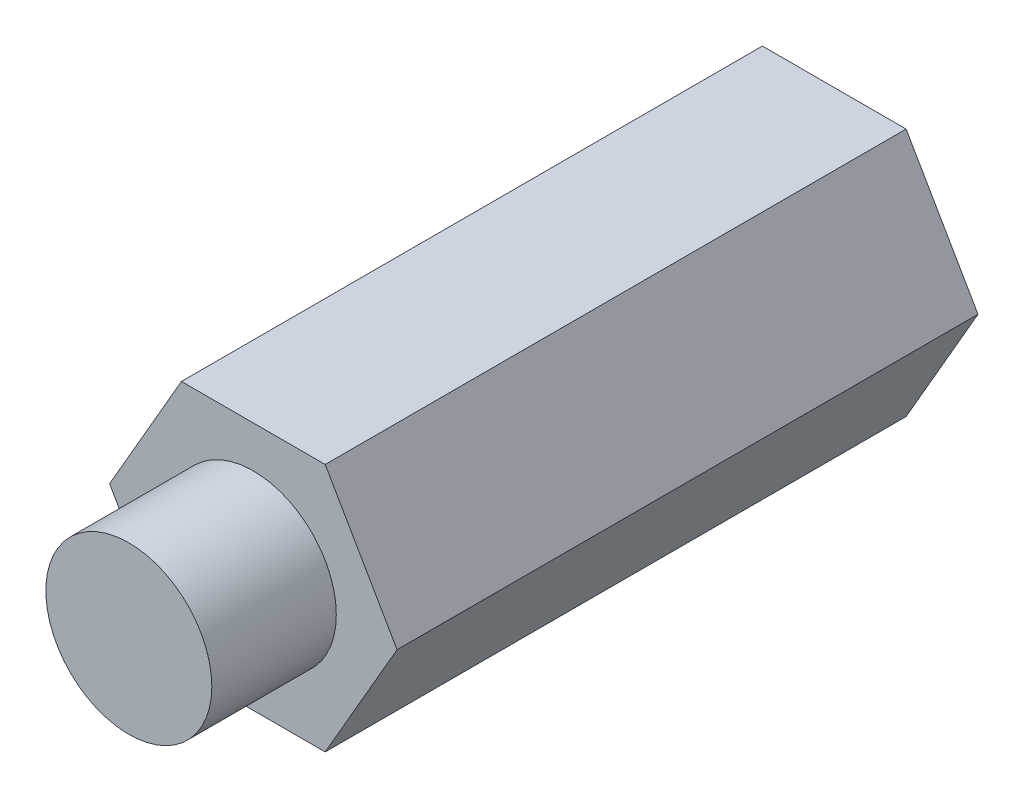
ISO-10303-21;
HEADER;
FILE_DESCRIPTION(('STEP AP214'),'2;1');
FILE_NAME('part.step','',(''),(''),'','','');
FILE_SCHEMA(('AUTOMOTIVE_DESIGN { 1 0 10303 214 1 1 1 1 }'));
ENDSEC;
DATA;
#1=APPLICATION_CONTEXT('core data for automotive mechanical design processes');
#2=APPLICATION_PROTOCOL_DEFINITION('international standard','automotive_design',2000,#1);
#3=PRODUCT_CONTEXT('',#1,'mechanical');
#4=PRODUCT('Part','Part','',(#3));
#5=PRODUCT_RELATED_PRODUCT_CATEGORY('part','',(#4));
#6=PRODUCT_DEFINITION_FORMATION('','',#4);
#7=PRODUCT_DEFINITION_CONTEXT('part definition',#1,'design');
#8=PRODUCT_DEFINITION('design','',#6,#7);
#9=PRODUCT_DEFINITION_SHAPE('','',#8);
#10=(LENGTH_UNIT() NAMED_UNIT(*) SI_UNIT(.MILLI.,.METRE.));
#11=(NAMED_UNIT(*) PLANE_ANGLE_UNIT() SI_UNIT($,.RADIAN.));
#12=(NAMED_UNIT(*) SI_UNIT($,.STERADIAN.) SOLID_ANGLE_UNIT());
#13=UNCERTAINTY_MEASURE_WITH_UNIT(LENGTH_MEASURE(1.E-05),#10,'distance_accuracy_value','');
#14=(GEOMETRIC_REPRESENTATION_CONTEXT(3) GLOBAL_UNCERTAINTY_ASSIGNED_CONTEXT((#13)) GLOBAL_UNIT_ASSIGNED_CONTEXT((#10,
#11,#12)) REPRESENTATION_CONTEXT('',''));
#15=CARTESIAN_POINT('',(0.,0.,0.));
#16=DIRECTION('',(0.,0.,1.));
#17=DIRECTION('',(1.,0.,0.));
#18=AXIS2_PLACEMENT_3D('',#15,#16,#17);
#19=CARTESIAN_POINT('',(3.46410161513775,0.,14.));
#20=DIRECTION('',(-0.866025403784438,-0.5,0.));
#21=DIRECTION('',(0.5,-0.866025403784439,0.));
#22=AXIS2_PLACEMENT_3D('',#19,#20,#21);
#23=PLANE('',#22);
#24=DIRECTION('',(-0.5,0.866025403784438,0.));
#25=VECTOR('',#24,1.);
#26=CARTESIAN_POINT('',(3.46410161513775,0.,0.));
#27=LINE('',#26,#25);
#28=CARTESIAN_POINT('',(3.46410161513775,0.,0.));
#29=VERTEX_POINT('',#28);
#30=CARTESIAN_POINT('',(1.73205080756888,3.,0.));
#31=VERTEX_POINT('',#30);
#32=EDGE_CURVE('E121',#29,#31,#27,.T.);
#33=ORIENTED_EDGE('',*,*,#32,.T.);
#34=DIRECTION('',(0.,0.,-1.));
#35=VECTOR('',#34,1.);
#36=CARTESIAN_POINT('',(1.73205080756888,3.,14.));
#37=LINE('',#36,#35);
#38=CARTESIAN_POINT('',(1.73205080756888,3.,14.));
#39=VERTEX_POINT('',#38);
#40=EDGE_CURVE('E36',#39,#31,#37,.T.);
#41=ORIENTED_EDGE('',*,*,#40,.F.);
#42=DIRECTION('',(-0.5,0.866025403784438,0.));
#43=VECTOR('',#42,1.);
#44=CARTESIAN_POINT('',(3.46410161513775,0.,14.));
#45=LINE('',#44,#43);
#46=CARTESIAN_POINT('',(3.46410161513775,0.,14.));
#47=VERTEX_POINT('',#46);
#48=EDGE_CURVE('E132',#47,#39,#45,.T.);
#49=ORIENTED_EDGE('',*,*,#48,.F.);
#50=DIRECTION('',(0.,0.,-1.));
#51=VECTOR('',#50,1.);
#52=CARTESIAN_POINT('',(3.46410161513775,0.,14.));
#53=LINE('',#52,#51);
#54=EDGE_CURVE('E117',#47,#29,#53,.T.);
#55=ORIENTED_EDGE('',*,*,#54,.T.);
#56=EDGE_LOOP('',(#33,#41,#49,#55));
#57=FACE_BOUND('',#56,.T.);
#58=ADVANCED_FACE('F33',(#57),#23,.F.);
#59=CARTESIAN_POINT('',(1.73205080756888,3.,14.));
#60=DIRECTION('',(0.,-1.,0.));
#61=DIRECTION('',(0.,0.,-1.));
#62=AXIS2_PLACEMENT_3D('',#59,#60,#61);
#63=PLANE('',#62);
#64=DIRECTION('',(-1.,0.,0.));
#65=VECTOR('',#64,1.);
#66=CARTESIAN_POINT('',(1.73205080756888,3.,0.));
#67=LINE('',#66,#65);
#68=CARTESIAN_POINT('',(-1.73205080756888,3.,0.));
#69=VERTEX_POINT('',#68);
#70=EDGE_CURVE('E124',#31,#69,#67,.T.);
#71=ORIENTED_EDGE('',*,*,#70,.T.);
#72=DIRECTION('',(0.,0.,-1.));
#73=VECTOR('',#72,1.);
#74=CARTESIAN_POINT('',(-1.73205080756888,3.,14.));
#75=LINE('',#74,#73);
#76=CARTESIAN_POINT('',(-1.73205080756888,3.,14.));
#77=VERTEX_POINT('',#76);
#78=EDGE_CURVE('E135',#77,#69,#75,.T.);
#79=ORIENTED_EDGE('',*,*,#78,.F.);
#80=DIRECTION('',(-1.,0.,0.));
#81=VECTOR('',#80,1.);
#82=CARTESIAN_POINT('',(1.73205080756888,3.,14.));
#83=LINE('',#82,#81);
#84=EDGE_CURVE('E89',#39,#77,#83,.T.);
#85=ORIENTED_EDGE('',*,*,#84,.F.);
#86=ORIENTED_EDGE('',*,*,#40,.T.);
#87=EDGE_LOOP('',(#71,#79,#85,#86));
#88=FACE_BOUND('',#87,.T.);
#89=ADVANCED_FACE('F140',(#88),#63,.F.);
#90=CARTESIAN_POINT('',(-1.73205080756888,3.,14.));
#91=DIRECTION('',(0.866025403784439,-0.499999999999999,0.));
#92=DIRECTION('',(0.499999999999999,0.866025403784439,0.));
#93=AXIS2_PLACEMENT_3D('',#90,#91,#92);
#94=PLANE('',#93);
#95=DIRECTION('',(-0.499999999999999,-0.866025403784439,0.));
#96=VECTOR('',#95,1.);
#97=CARTESIAN_POINT('',(-1.73205080756888,3.,0.));
#98=LINE('',#97,#96);
#99=CARTESIAN_POINT('',(-3.46410161513775,0.,0.));
#100=VERTEX_POINT('',#99);
#101=EDGE_CURVE('E127',#69,#100,#98,.T.);
#102=ORIENTED_EDGE('',*,*,#101,.T.);
#103=DIRECTION('',(0.,0.,-1.));
#104=VECTOR('',#103,1.);
#105=CARTESIAN_POINT('',(-3.46410161513775,0.,14.));
#106=LINE('',#105,#104);
#107=CARTESIAN_POINT('',(-3.46410161513775,0.,14.));
#108=VERTEX_POINT('',#107);
#109=EDGE_CURVE('E112',#108,#100,#106,.T.);
#110=ORIENTED_EDGE('',*,*,#109,.F.);
#111=DIRECTION('',(-0.499999999999999,-0.866025403784439,0.));
#112=VECTOR('',#111,1.);
#113=CARTESIAN_POINT('',(-1.73205080756888,3.,14.));
#114=LINE('',#113,#112);
#115=EDGE_CURVE('E103',#77,#108,#114,.T.);
#116=ORIENTED_EDGE('',*,*,#115,.F.);
#117=ORIENTED_EDGE('',*,*,#78,.T.);
#118=EDGE_LOOP('',(#102,#110,#116,#117));
#119=FACE_BOUND('',#118,.T.);
#120=ADVANCED_FACE('F146',(#119),#94,.F.);
#121=CARTESIAN_POINT('',(-3.46410161513775,0.,14.));
#122=DIRECTION('',(0.866025403784438,0.5,0.));
#123=DIRECTION('',(-0.5,0.866025403784438,0.));
#124=AXIS2_PLACEMENT_3D('',#121,#122,#123);
#125=PLANE('',#124);
#126=DIRECTION('',(0.5,-0.866025403784438,0.));
#127=VECTOR('',#126,1.);
#128=CARTESIAN_POINT('',(-3.46410161513775,0.,0.));
#129=LINE('',#128,#127);
#130=CARTESIAN_POINT('',(-1.73205080756887,-3.,0.));
#131=VERTEX_POINT('',#130);
#132=EDGE_CURVE('E111',#100,#131,#129,.T.);
#133=ORIENTED_EDGE('',*,*,#132,.T.);
#134=DIRECTION('',(0.,0.,-1.));
#135=VECTOR('',#134,1.);
#136=CARTESIAN_POINT('',(-1.73205080756887,-3.,14.));
#137=LINE('',#136,#135);
#138=CARTESIAN_POINT('',(-1.73205080756887,-3.,14.));
#139=VERTEX_POINT('',#138);
#140=EDGE_CURVE('E108',#139,#131,#137,.T.);
#141=ORIENTED_EDGE('',*,*,#140,.F.);
#142=DIRECTION('',(0.5,-0.866025403784438,0.));
#143=VECTOR('',#142,1.);
#144=CARTESIAN_POINT('',(-3.46410161513775,0.,14.));
#145=LINE('',#144,#143);
#146=EDGE_CURVE('E97',#108,#139,#145,.T.);
#147=ORIENTED_EDGE('',*,*,#146,.F.);
#148=ORIENTED_EDGE('',*,*,#109,.T.);
#149=EDGE_LOOP('',(#133,#141,#147,#148));
#150=FACE_BOUND('',#149,.T.);
#151=ADVANCED_FACE('F109',(#150),#125,.F.);
#152=CARTESIAN_POINT('',(-1.73205080756887,-3.,14.));
#153=DIRECTION('',(0.,1.,0.));
#154=DIRECTION('',(-1.,0.,0.));
#155=AXIS2_PLACEMENT_3D('',#152,#153,#154);
#156=PLANE('',#155);
#157=DIRECTION('',(1.,0.,0.));
#158=VECTOR('',#157,1.);
#159=CARTESIAN_POINT('',(-1.73205080756887,-3.,0.));
#160=LINE('',#159,#158);
#161=CARTESIAN_POINT('',(1.73205080756888,-3.,0.));
#162=VERTEX_POINT('',#161);
#163=EDGE_CURVE('E74',#131,#162,#160,.T.);
#164=ORIENTED_EDGE('',*,*,#163,.T.);
#165=DIRECTION('',(0.,0.,-1.));
#166=VECTOR('',#165,1.);
#167=CARTESIAN_POINT('',(1.73205080756888,-3.,14.));
#168=LINE('',#167,#166);
#169=CARTESIAN_POINT('',(1.73205080756888,-3.,14.));
#170=VERTEX_POINT('',#169);
#171=EDGE_CURVE('E113',#170,#162,#168,.T.);
#172=ORIENTED_EDGE('',*,*,#171,.F.);
#173=DIRECTION('',(1.,0.,0.));
#174=VECTOR('',#173,1.);
#175=CARTESIAN_POINT('',(-1.73205080756887,-3.,14.));
#176=LINE('',#175,#174);
#177=EDGE_CURVE('E101',#139,#170,#176,.T.);
#178=ORIENTED_EDGE('',*,*,#177,.F.);
#179=ORIENTED_EDGE('',*,*,#140,.T.);
#180=EDGE_LOOP('',(#164,#172,#178,#179));
#181=FACE_BOUND('',#180,.T.);
#182=ADVANCED_FACE('F115',(#181),#156,.F.);
#183=CARTESIAN_POINT('',(1.73205080756888,-3.,14.));
#184=DIRECTION('',(-0.866025403784439,0.5,0.));
#185=DIRECTION('',(-0.5,-0.866025403784439,0.));
#186=AXIS2_PLACEMENT_3D('',#183,#184,#185);
#187=PLANE('',#186);
#188=DIRECTION('',(0.5,0.866025403784439,0.));
#189=VECTOR('',#188,1.);
#190=CARTESIAN_POINT('',(1.73205080756888,-3.,0.));
#191=LINE('',#190,#189);
#192=EDGE_CURVE('E80',#162,#29,#191,.T.);
#193=ORIENTED_EDGE('',*,*,#192,.T.);
#194=ORIENTED_EDGE('',*,*,#54,.F.);
#195=DIRECTION('',(0.5,0.866025403784439,0.));
#196=VECTOR('',#195,1.);
#197=CARTESIAN_POINT('',(1.73205080756888,-3.,14.));
#198=LINE('',#197,#196);
#199=EDGE_CURVE('E50',#170,#47,#198,.T.);
#200=ORIENTED_EDGE('',*,*,#199,.F.);
#201=ORIENTED_EDGE('',*,*,#171,.T.);
#202=EDGE_LOOP('',(#193,#194,#200,#201));
#203=FACE_BOUND('',#202,.T.);
#204=ADVANCED_FACE('F171',(#203),#187,.F.);
#205=CARTESIAN_POINT('',(0.,0.,14.));
#206=DIRECTION('',(0.,0.,1.));
#207=DIRECTION('',(1.,0.,0.));
#208=AXIS2_PLACEMENT_3D('',#205,#206,#207);
#209=PLANE('',#208);
#210=CARTESIAN_POINT('',(0.,0.,14.));
#211=DIRECTION('',(0.,0.,1.));
#212=DIRECTION('',(1.,0.,0.));
#213=AXIS2_PLACEMENT_3D('',#210,#211,#212);
#214=CIRCLE('',#213,2.);
#215=CARTESIAN_POINT('',(2.,0.,14.));
#216=VERTEX_POINT('',#215);
#217=EDGE_CURVE('E11',#216,#216,#214,.T.);
#218=ORIENTED_EDGE('',*,*,#217,.F.);
#219=EDGE_LOOP('',(#218));
#220=FACE_BOUND('',#219,.T.);
#221=ORIENTED_EDGE('',*,*,#48,.T.);
#222=ORIENTED_EDGE('',*,*,#84,.T.);
#223=ORIENTED_EDGE('',*,*,#115,.T.);
#224=ORIENTED_EDGE('',*,*,#146,.T.);
#225=ORIENTED_EDGE('',*,*,#177,.T.);
#226=ORIENTED_EDGE('',*,*,#199,.T.);
#227=EDGE_LOOP('',(#221,#222,#223,#224,#225,#226));
#228=FACE_BOUND('',#227,.T.);
#229=ADVANCED_FACE('F99',(#220,#228),#209,.T.);
#230=CARTESIAN_POINT('',(0.,0.,0.));
#231=DIRECTION('',(0.,0.,1.));
#232=DIRECTION('',(1.,0.,0.));
#233=AXIS2_PLACEMENT_3D('',#230,#231,#232);
#234=PLANE('',#233);
#235=CARTESIAN_POINT('',(0.,0.,0.));
#236=DIRECTION('',(0.,0.,-1.));
#237=DIRECTION('',(-1.,0.,0.));
#238=AXIS2_PLACEMENT_3D('',#235,#236,#237);
#239=CIRCLE('',#238,1.49999999999999);
#240=CARTESIAN_POINT('',(-1.49999999999999,0.,0.));
#241=VERTEX_POINT('',#240);
#242=EDGE_CURVE('E155',#241,#241,#239,.T.);
#243=ORIENTED_EDGE('',*,*,#242,.F.);
#244=EDGE_LOOP('',(#243));
#245=FACE_BOUND('',#244,.T.);
#246=ORIENTED_EDGE('',*,*,#32,.F.);
#247=ORIENTED_EDGE('',*,*,#192,.F.);
#248=ORIENTED_EDGE('',*,*,#163,.F.);
#249=ORIENTED_EDGE('',*,*,#132,.F.);
#250=ORIENTED_EDGE('',*,*,#101,.F.);
#251=ORIENTED_EDGE('',*,*,#70,.F.);
#252=EDGE_LOOP('',(#246,#247,#248,#249,#250,#251));
#253=FACE_BOUND('',#252,.T.);
#254=ADVANCED_FACE('F145',(#245,#253),#234,.F.);
#255=CARTESIAN_POINT('',(0.,0.,17.));
#256=DIRECTION('',(0.,0.,-1.));
#257=DIRECTION('',(-1.,0.,0.));
#258=AXIS2_PLACEMENT_3D('',#255,#256,#257);
#259=CYLINDRICAL_SURFACE('',#258,2.);
#260=CARTESIAN_POINT('',(0.,0.,17.));
#261=DIRECTION('',(0.,0.,1.));
#262=DIRECTION('',(1.,0.,0.));
#263=AXIS2_PLACEMENT_3D('',#260,#261,#262);
#264=CIRCLE('',#263,2.);
#265=CARTESIAN_POINT('',(2.,0.,17.));
#266=VERTEX_POINT('',#265);
#267=EDGE_CURVE('E125',#266,#266,#264,.T.);
#268=ORIENTED_EDGE('',*,*,#267,.F.);
#269=EDGE_LOOP('',(#268));
#270=FACE_BOUND('',#269,.T.);
#271=ORIENTED_EDGE('',*,*,#217,.T.);
#272=EDGE_LOOP('',(#271));
#273=FACE_BOUND('',#272,.T.);
#274=ADVANCED_FACE('F162',(#270,#273),#259,.T.);
#275=CARTESIAN_POINT('',(0.,0.,17.));
#276=DIRECTION('',(0.,0.,1.));
#277=DIRECTION('',(1.,0.,0.));
#278=AXIS2_PLACEMENT_3D('',#275,#276,#277);
#279=PLANE('',#278);
#280=ORIENTED_EDGE('',*,*,#267,.T.);
#281=EDGE_LOOP('',(#280));
#282=FACE_BOUND('',#281,.T.);
#283=ADVANCED_FACE('F168',(#282),#279,.T.);
#284=CARTESIAN_POINT('',(0.,0.,6.));
#285=DIRECTION('',(0.,0.,-1.));
#286=DIRECTION('',(-1.,0.,0.));
#287=AXIS2_PLACEMENT_3D('',#284,#285,#286);
#288=CONICAL_SURFACE('',#287,1.5,1.02974425867665);
#289=CARTESIAN_POINT('',(0.,0.,6.90129092854134));
#290=VERTEX_POINT('',#289);
#291=VERTEX_LOOP('',#290);
#292=FACE_BOUND('',#291,.T.);
#293=CARTESIAN_POINT('',(0.,0.,6.));
#294=DIRECTION('',(0.,0.,-1.));
#295=DIRECTION('',(-1.,0.,0.));
#296=AXIS2_PLACEMENT_3D('',#293,#294,#295);
#297=CIRCLE('',#296,1.5);
#298=CARTESIAN_POINT('',(-1.5,0.,6.));
#299=VERTEX_POINT('',#298);
#300=EDGE_CURVE('E152',#299,#299,#297,.T.);
#301=ORIENTED_EDGE('',*,*,#300,.T.);
#302=EDGE_LOOP('',(#301));
#303=FACE_BOUND('',#302,.T.);
#304=ADVANCED_FACE('F211',(#292,#303),#288,.F.);
#305=CARTESIAN_POINT('',(0.,0.,0.));
#306=DIRECTION('',(0.,0.,-1.));
#307=DIRECTION('',(-1.,0.,0.));
#308=AXIS2_PLACEMENT_3D('',#305,#306,#307);
#309=CYLINDRICAL_SURFACE('',#308,1.49999999999999);
#310=ORIENTED_EDGE('',*,*,#300,.F.);
#311=EDGE_LOOP('',(#310));
#312=FACE_BOUND('',#311,.T.);
#313=ORIENTED_EDGE('',*,*,#242,.T.);
#314=EDGE_LOOP('',(#313));
#315=FACE_BOUND('',#314,.T.);
#316=ADVANCED_FACE('F159',(#312,#315),#309,.F.);
#317=CLOSED_SHELL('',(#58,#89,#120,#151,#182,#204,#229,#254,#274,#283,#304,#316));
#318=MANIFOLD_SOLID_BREP('B2',#317);
#319=ADVANCED_BREP_SHAPE_REPRESENTATION('',(#18,#318),#14);
#320=SHAPE_DEFINITION_REPRESENTATION(#9,#319);
ENDSEC;
END-ISO-10303-21;
